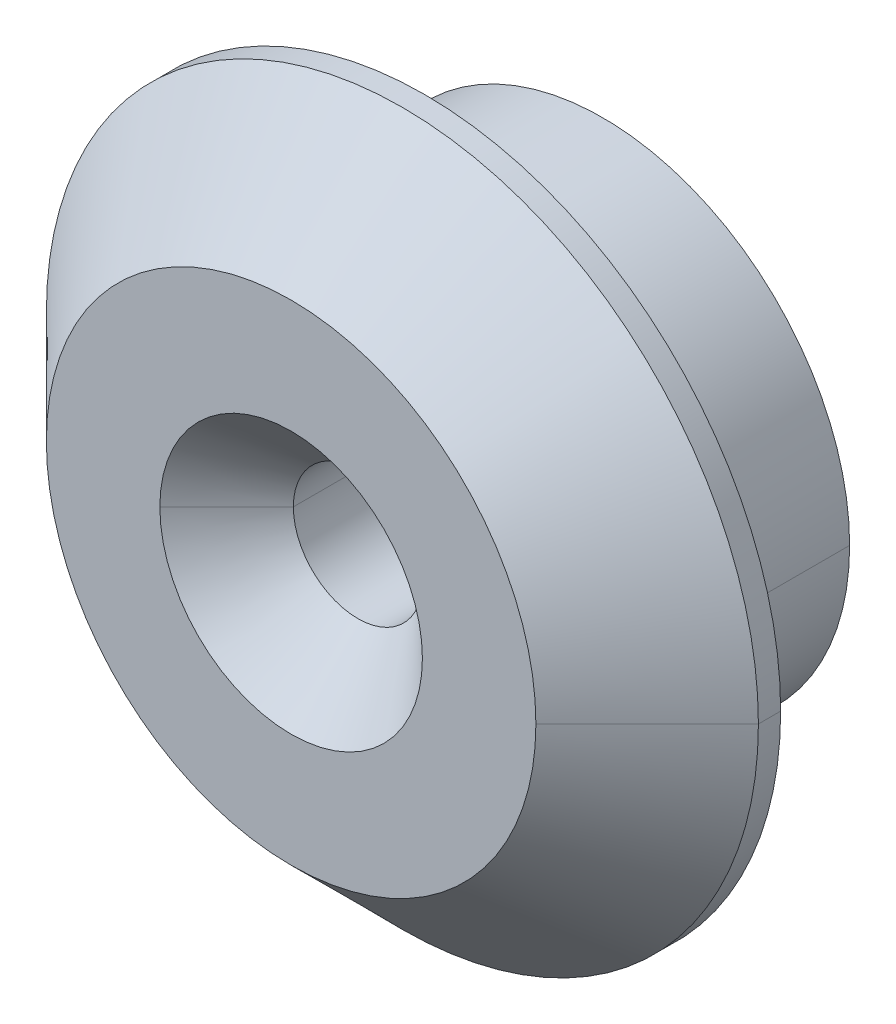
ISO-10303-21;
HEADER;
FILE_DESCRIPTION(('STEP AP214'),'2;1');
FILE_NAME('part.step','',(''),(''),'','','');
FILE_SCHEMA(('AUTOMOTIVE_DESIGN { 1 0 10303 214 1 1 1 1 }'));
ENDSEC;
DATA;
#1=APPLICATION_CONTEXT('core data for automotive mechanical design processes');
#2=APPLICATION_PROTOCOL_DEFINITION('international standard','automotive_design',2000,#1);
#3=PRODUCT_CONTEXT('',#1,'mechanical');
#4=PRODUCT('Part','Part','',(#3));
#5=PRODUCT_RELATED_PRODUCT_CATEGORY('part','',(#4));
#6=PRODUCT_DEFINITION_FORMATION('','',#4);
#7=PRODUCT_DEFINITION_CONTEXT('part definition',#1,'design');
#8=PRODUCT_DEFINITION('design','',#6,#7);
#9=PRODUCT_DEFINITION_SHAPE('','',#8);
#10=(LENGTH_UNIT() NAMED_UNIT(*) SI_UNIT(.MILLI.,.METRE.));
#11=(NAMED_UNIT(*) PLANE_ANGLE_UNIT() SI_UNIT($,.RADIAN.));
#12=(NAMED_UNIT(*) SI_UNIT($,.STERADIAN.) SOLID_ANGLE_UNIT());
#13=UNCERTAINTY_MEASURE_WITH_UNIT(LENGTH_MEASURE(1.E-05),#10,'distance_accuracy_value','');
#14=(GEOMETRIC_REPRESENTATION_CONTEXT(3) GLOBAL_UNCERTAINTY_ASSIGNED_CONTEXT((#13)) GLOBAL_UNIT_ASSIGNED_CONTEXT((#10,
#11,#12)) REPRESENTATION_CONTEXT('',''));
#15=CARTESIAN_POINT('',(0.,0.,0.));
#16=DIRECTION('',(0.,0.,1.));
#17=DIRECTION('',(1.,0.,0.));
#18=AXIS2_PLACEMENT_3D('',#15,#16,#17);
#19=CARTESIAN_POINT('',(0.,0.,7.));
#20=DIRECTION('',(0.,0.,-1.));
#21=DIRECTION('',(-1.,0.,0.));
#22=AXIS2_PLACEMENT_3D('',#19,#20,#21);
#23=CONICAL_SURFACE('',#22,5.5,0.785398163397447);
#24=CARTESIAN_POINT('',(0.,0.,7.));
#25=DIRECTION('',(0.,0.,1.));
#26=DIRECTION('',(1.,0.,0.));
#27=AXIS2_PLACEMENT_3D('',#24,#25,#26);
#28=CIRCLE('',#27,5.5);
#29=CARTESIAN_POINT('',(5.5,0.,7.));
#30=VERTEX_POINT('',#29);
#31=CARTESIAN_POINT('',(-5.5,0.,7.));
#32=VERTEX_POINT('',#31);
#33=EDGE_CURVE('E41',#30,#32,#28,.T.);
#34=ORIENTED_EDGE('',*,*,#33,.F.);
#35=DIRECTION('',(0.707106781186547,0.,-0.707106781186549));
#36=VECTOR('',#35,1.);
#37=CARTESIAN_POINT('',(5.5,0.,7.));
#38=LINE('',#37,#36);
#39=CARTESIAN_POINT('',(8.,0.,4.5));
#40=VERTEX_POINT('',#39);
#41=EDGE_CURVE('E11',#30,#40,#38,.T.);
#42=ORIENTED_EDGE('',*,*,#41,.T.);
#43=CARTESIAN_POINT('',(0.,0.,4.5));
#44=DIRECTION('',(0.,0.,-1.));
#45=DIRECTION('',(1.,0.,0.));
#46=AXIS2_PLACEMENT_3D('',#43,#44,#45);
#47=CIRCLE('',#46,8.);
#48=CARTESIAN_POINT('',(-8.,0.,4.5));
#49=VERTEX_POINT('',#48);
#50=EDGE_CURVE('E27',#49,#40,#47,.T.);
#51=ORIENTED_EDGE('',*,*,#50,.F.);
#52=DIRECTION('',(-0.707106781186547,0.,-0.707106781186549));
#53=VECTOR('',#52,1.);
#54=CARTESIAN_POINT('',(-5.5,0.,7.));
#55=LINE('',#54,#53);
#56=EDGE_CURVE('E20',#32,#49,#55,.T.);
#57=ORIENTED_EDGE('',*,*,#56,.F.);
#58=EDGE_LOOP('',(#34,#42,#51,#57));
#59=FACE_BOUND('',#58,.T.);
#60=ADVANCED_FACE('F17',(#59),#23,.T.);
#61=CARTESIAN_POINT('',(0.,0.,7.));
#62=DIRECTION('',(0.,0.,-1.));
#63=DIRECTION('',(-1.,0.,0.));
#64=AXIS2_PLACEMENT_3D('',#61,#62,#63);
#65=CYLINDRICAL_SURFACE('',#64,8.);
#66=ORIENTED_EDGE('',*,*,#50,.T.);
#67=DIRECTION('',(0.,0.,-1.));
#68=VECTOR('',#67,1.);
#69=CARTESIAN_POINT('',(8.,0.,7.));
#70=LINE('',#69,#68);
#71=CARTESIAN_POINT('',(8.,0.,4.));
#72=VERTEX_POINT('',#71);
#73=EDGE_CURVE('E145',#40,#72,#70,.T.);
#74=ORIENTED_EDGE('',*,*,#73,.T.);
#75=CARTESIAN_POINT('',(0.,0.,4.));
#76=DIRECTION('',(0.,0.,1.));
#77=DIRECTION('',(1.,0.,0.));
#78=AXIS2_PLACEMENT_3D('',#75,#76,#77);
#79=CIRCLE('',#78,8.);
#80=CARTESIAN_POINT('',(-8.,0.,4.));
#81=VERTEX_POINT('',#80);
#82=EDGE_CURVE('E124',#72,#81,#79,.T.);
#83=ORIENTED_EDGE('',*,*,#82,.T.);
#84=DIRECTION('',(0.,0.,-1.));
#85=VECTOR('',#84,1.);
#86=CARTESIAN_POINT('',(-8.,0.,7.));
#87=LINE('',#86,#85);
#88=EDGE_CURVE('E155',#49,#81,#87,.T.);
#89=ORIENTED_EDGE('',*,*,#88,.F.);
#90=EDGE_LOOP('',(#66,#74,#83,#89));
#91=FACE_BOUND('',#90,.T.);
#92=ADVANCED_FACE('F313',(#91),#65,.T.);
#93=CARTESIAN_POINT('',(0.,0.,5.5));
#94=DIRECTION('',(0.,0.,1.));
#95=DIRECTION('',(1.,0.,0.));
#96=AXIS2_PLACEMENT_3D('',#93,#94,#95);
#97=CONICAL_SURFACE('',#96,1.45,0.785398163397449);
#98=CARTESIAN_POINT('',(0.,0.,5.5));
#99=DIRECTION('',(0.,0.,1.));
#100=DIRECTION('',(1.,0.,0.));
#101=AXIS2_PLACEMENT_3D('',#98,#99,#100);
#102=CIRCLE('',#101,1.45);
#103=CARTESIAN_POINT('',(-1.45,0.,5.5));
#104=VERTEX_POINT('',#103);
#105=CARTESIAN_POINT('',(1.45,0.,5.5));
#106=VERTEX_POINT('',#105);
#107=EDGE_CURVE('E106',#104,#106,#102,.T.);
#108=ORIENTED_EDGE('',*,*,#107,.F.);
#109=DIRECTION('',(-0.707106781186548,0.,0.707106781186547));
#110=VECTOR('',#109,1.);
#111=CARTESIAN_POINT('',(-1.45,0.,5.5));
#112=LINE('',#111,#110);
#113=CARTESIAN_POINT('',(-2.95,0.,7.));
#114=VERTEX_POINT('',#113);
#115=EDGE_CURVE('E121',#104,#114,#112,.T.);
#116=ORIENTED_EDGE('',*,*,#115,.T.);
#117=CARTESIAN_POINT('',(0.,0.,7.));
#118=DIRECTION('',(0.,0.,-1.));
#119=DIRECTION('',(1.,0.,0.));
#120=AXIS2_PLACEMENT_3D('',#117,#118,#119);
#121=CIRCLE('',#120,2.95);
#122=CARTESIAN_POINT('',(2.95,0.,7.));
#123=VERTEX_POINT('',#122);
#124=EDGE_CURVE('E139',#123,#114,#121,.T.);
#125=ORIENTED_EDGE('',*,*,#124,.F.);
#126=DIRECTION('',(0.707106781186548,0.,0.707106781186547));
#127=VECTOR('',#126,1.);
#128=CARTESIAN_POINT('',(1.45,0.,5.5));
#129=LINE('',#128,#127);
#130=EDGE_CURVE('E171',#106,#123,#129,.T.);
#131=ORIENTED_EDGE('',*,*,#130,.F.);
#132=EDGE_LOOP('',(#108,#116,#125,#131));
#133=FACE_BOUND('',#132,.T.);
#134=ADVANCED_FACE('F219',(#133),#97,.F.);
#135=CARTESIAN_POINT('',(0.,0.,7.));
#136=DIRECTION('',(0.,0.,-1.));
#137=DIRECTION('',(-1.,0.,0.));
#138=AXIS2_PLACEMENT_3D('',#135,#136,#137);
#139=CYLINDRICAL_SURFACE('',#138,1.45);
#140=ORIENTED_EDGE('',*,*,#107,.T.);
#141=DIRECTION('',(0.,0.,-1.));
#142=VECTOR('',#141,1.);
#143=CARTESIAN_POINT('',(1.45,0.,7.));
#144=LINE('',#143,#142);
#145=CARTESIAN_POINT('',(1.45,0.,0.));
#146=VERTEX_POINT('',#145);
#147=EDGE_CURVE('E103',#106,#146,#144,.T.);
#148=ORIENTED_EDGE('',*,*,#147,.T.);
#149=CARTESIAN_POINT('',(0.,0.,0.));
#150=DIRECTION('',(0.,0.,1.));
#151=DIRECTION('',(1.,0.,0.));
#152=AXIS2_PLACEMENT_3D('',#149,#150,#151);
#153=CIRCLE('',#152,1.45);
#154=CARTESIAN_POINT('',(-1.45,0.,0.));
#155=VERTEX_POINT('',#154);
#156=EDGE_CURVE('E93',#155,#146,#153,.T.);
#157=ORIENTED_EDGE('',*,*,#156,.F.);
#158=DIRECTION('',(0.,0.,-1.));
#159=VECTOR('',#158,1.);
#160=CARTESIAN_POINT('',(-1.45,0.,7.));
#161=LINE('',#160,#159);
#162=EDGE_CURVE('E85',#104,#155,#161,.T.);
#163=ORIENTED_EDGE('',*,*,#162,.F.);
#164=EDGE_LOOP('',(#140,#148,#157,#163));
#165=FACE_BOUND('',#164,.T.);
#166=ADVANCED_FACE('F104',(#165),#139,.F.);
#167=CARTESIAN_POINT('',(0.,0.,7.));
#168=DIRECTION('',(0.,0.,-1.));
#169=DIRECTION('',(-1.,0.,0.));
#170=AXIS2_PLACEMENT_3D('',#167,#168,#169);
#171=CYLINDRICAL_SURFACE('',#170,5.55);
#172=CARTESIAN_POINT('',(0.,0.,4.));
#173=DIRECTION('',(0.,0.,1.));
#174=DIRECTION('',(1.,0.,0.));
#175=AXIS2_PLACEMENT_3D('',#172,#173,#174);
#176=CIRCLE('',#175,5.55);
#177=CARTESIAN_POINT('',(5.55,0.,4.));
#178=VERTEX_POINT('',#177);
#179=CARTESIAN_POINT('',(-5.55,0.,4.));
#180=VERTEX_POINT('',#179);
#181=EDGE_CURVE('E125',#178,#180,#176,.T.);
#182=ORIENTED_EDGE('',*,*,#181,.F.);
#183=DIRECTION('',(0.,0.,-1.));
#184=VECTOR('',#183,1.);
#185=CARTESIAN_POINT('',(5.55,0.,7.));
#186=LINE('',#185,#184);
#187=CARTESIAN_POINT('',(5.55,0.,0.));
#188=VERTEX_POINT('',#187);
#189=EDGE_CURVE('E109',#178,#188,#186,.T.);
#190=ORIENTED_EDGE('',*,*,#189,.T.);
#191=CARTESIAN_POINT('',(0.,0.,0.));
#192=DIRECTION('',(0.,0.,1.));
#193=DIRECTION('',(1.,0.,0.));
#194=AXIS2_PLACEMENT_3D('',#191,#192,#193);
#195=CIRCLE('',#194,5.55);
#196=CARTESIAN_POINT('',(-5.55,0.,0.));
#197=VERTEX_POINT('',#196);
#198=EDGE_CURVE('E166',#188,#197,#195,.T.);
#199=ORIENTED_EDGE('',*,*,#198,.T.);
#200=DIRECTION('',(0.,0.,-1.));
#201=VECTOR('',#200,1.);
#202=CARTESIAN_POINT('',(-5.55,0.,7.));
#203=LINE('',#202,#201);
#204=EDGE_CURVE('E137',#180,#197,#203,.T.);
#205=ORIENTED_EDGE('',*,*,#204,.F.);
#206=EDGE_LOOP('',(#182,#190,#199,#205));
#207=FACE_BOUND('',#206,.T.);
#208=ADVANCED_FACE('F202',(#207),#171,.T.);
#209=CARTESIAN_POINT('',(0.,0.,7.));
#210=DIRECTION('',(0.,0.,-1.));
#211=DIRECTION('',(-1.,0.,0.));
#212=AXIS2_PLACEMENT_3D('',#209,#210,#211);
#213=CYLINDRICAL_SURFACE('',#212,5.55);
#214=ORIENTED_EDGE('',*,*,#189,.F.);
#215=CARTESIAN_POINT('',(0.,0.,4.));
#216=DIRECTION('',(0.,0.,1.));
#217=DIRECTION('',(1.,0.,0.));
#218=AXIS2_PLACEMENT_3D('',#215,#216,#217);
#219=CIRCLE('',#218,5.55);
#220=EDGE_CURVE('E128',#180,#178,#219,.T.);
#221=ORIENTED_EDGE('',*,*,#220,.F.);
#222=ORIENTED_EDGE('',*,*,#204,.T.);
#223=CARTESIAN_POINT('',(0.,0.,0.));
#224=DIRECTION('',(0.,0.,1.));
#225=DIRECTION('',(1.,0.,0.));
#226=AXIS2_PLACEMENT_3D('',#223,#224,#225);
#227=CIRCLE('',#226,5.55);
#228=EDGE_CURVE('E133',#197,#188,#227,.T.);
#229=ORIENTED_EDGE('',*,*,#228,.T.);
#230=EDGE_LOOP('',(#214,#221,#222,#229));
#231=FACE_BOUND('',#230,.T.);
#232=ADVANCED_FACE('F207',(#231),#213,.T.);
#233=CARTESIAN_POINT('',(0.,0.,7.));
#234=DIRECTION('',(0.,0.,1.));
#235=DIRECTION('',(1.,0.,0.));
#236=AXIS2_PLACEMENT_3D('',#233,#234,#235);
#237=PLANE('',#236);
#238=CARTESIAN_POINT('',(0.,0.,7.));
#239=DIRECTION('',(0.,0.,1.));
#240=DIRECTION('',(1.,0.,0.));
#241=AXIS2_PLACEMENT_3D('',#238,#239,#240);
#242=CIRCLE('',#241,5.5);
#243=EDGE_CURVE('E138',#32,#30,#242,.T.);
#244=ORIENTED_EDGE('',*,*,#243,.T.);
#245=ORIENTED_EDGE('',*,*,#33,.T.);
#246=EDGE_LOOP('',(#244,#245));
#247=FACE_BOUND('',#246,.T.);
#248=ORIENTED_EDGE('',*,*,#124,.T.);
#249=CARTESIAN_POINT('',(0.,0.,7.));
#250=DIRECTION('',(0.,0.,-1.));
#251=DIRECTION('',(1.,0.,0.));
#252=AXIS2_PLACEMENT_3D('',#249,#250,#251);
#253=CIRCLE('',#252,2.95);
#254=EDGE_CURVE('E99',#114,#123,#253,.T.);
#255=ORIENTED_EDGE('',*,*,#254,.T.);
#256=EDGE_LOOP('',(#248,#255));
#257=FACE_BOUND('',#256,.T.);
#258=ADVANCED_FACE('F272',(#247,#257),#237,.T.);
#259=CARTESIAN_POINT('',(0.,0.,0.));
#260=DIRECTION('',(0.,0.,1.));
#261=DIRECTION('',(1.,0.,0.));
#262=AXIS2_PLACEMENT_3D('',#259,#260,#261);
#263=PLANE('',#262);
#264=ORIENTED_EDGE('',*,*,#228,.F.);
#265=ORIENTED_EDGE('',*,*,#198,.F.);
#266=EDGE_LOOP('',(#264,#265));
#267=FACE_BOUND('',#266,.T.);
#268=ORIENTED_EDGE('',*,*,#156,.T.);
#269=CARTESIAN_POINT('',(0.,0.,0.));
#270=DIRECTION('',(0.,0.,1.));
#271=DIRECTION('',(1.,0.,0.));
#272=AXIS2_PLACEMENT_3D('',#269,#270,#271);
#273=CIRCLE('',#272,1.45);
#274=EDGE_CURVE('E96',#146,#155,#273,.T.);
#275=ORIENTED_EDGE('',*,*,#274,.T.);
#276=EDGE_LOOP('',(#268,#275));
#277=FACE_BOUND('',#276,.T.);
#278=ADVANCED_FACE('F95',(#267,#277),#263,.F.);
#279=CARTESIAN_POINT('',(0.,0.,7.));
#280=DIRECTION('',(0.,0.,-1.));
#281=DIRECTION('',(-1.,0.,0.));
#282=AXIS2_PLACEMENT_3D('',#279,#280,#281);
#283=CYLINDRICAL_SURFACE('',#282,1.45);
#284=ORIENTED_EDGE('',*,*,#147,.F.);
#285=CARTESIAN_POINT('',(0.,0.,5.5));
#286=DIRECTION('',(0.,0.,1.));
#287=DIRECTION('',(1.,0.,0.));
#288=AXIS2_PLACEMENT_3D('',#285,#286,#287);
#289=CIRCLE('',#288,1.45);
#290=EDGE_CURVE('E113',#106,#104,#289,.T.);
#291=ORIENTED_EDGE('',*,*,#290,.T.);
#292=ORIENTED_EDGE('',*,*,#162,.T.);
#293=ORIENTED_EDGE('',*,*,#274,.F.);
#294=EDGE_LOOP('',(#284,#291,#292,#293));
#295=FACE_BOUND('',#294,.T.);
#296=ADVANCED_FACE('F111',(#295),#283,.F.);
#297=CARTESIAN_POINT('',(0.,0.,5.5));
#298=DIRECTION('',(0.,0.,1.));
#299=DIRECTION('',(1.,0.,0.));
#300=AXIS2_PLACEMENT_3D('',#297,#298,#299);
#301=CONICAL_SURFACE('',#300,1.45,0.785398163397449);
#302=ORIENTED_EDGE('',*,*,#115,.F.);
#303=ORIENTED_EDGE('',*,*,#290,.F.);
#304=ORIENTED_EDGE('',*,*,#130,.T.);
#305=ORIENTED_EDGE('',*,*,#254,.F.);
#306=EDGE_LOOP('',(#302,#303,#304,#305));
#307=FACE_BOUND('',#306,.T.);
#308=ADVANCED_FACE('F229',(#307),#301,.F.);
#309=CARTESIAN_POINT('',(0.,0.,4.));
#310=DIRECTION('',(0.,0.,1.));
#311=DIRECTION('',(1.,0.,0.));
#312=AXIS2_PLACEMENT_3D('',#309,#310,#311);
#313=PLANE('',#312);
#314=CARTESIAN_POINT('',(0.,0.,4.));
#315=DIRECTION('',(0.,0.,1.));
#316=DIRECTION('',(1.,0.,0.));
#317=AXIS2_PLACEMENT_3D('',#314,#315,#316);
#318=CIRCLE('',#317,8.);
#319=EDGE_CURVE('E161',#81,#72,#318,.T.);
#320=ORIENTED_EDGE('',*,*,#319,.F.);
#321=ORIENTED_EDGE('',*,*,#82,.F.);
#322=EDGE_LOOP('',(#320,#321));
#323=FACE_BOUND('',#322,.T.);
#324=ORIENTED_EDGE('',*,*,#220,.T.);
#325=ORIENTED_EDGE('',*,*,#181,.T.);
#326=EDGE_LOOP('',(#324,#325));
#327=FACE_BOUND('',#326,.T.);
#328=ADVANCED_FACE('F241',(#323,#327),#313,.F.);
#329=CARTESIAN_POINT('',(0.,0.,7.));
#330=DIRECTION('',(0.,0.,-1.));
#331=DIRECTION('',(-1.,0.,0.));
#332=AXIS2_PLACEMENT_3D('',#329,#330,#331);
#333=CYLINDRICAL_SURFACE('',#332,8.);
#334=ORIENTED_EDGE('',*,*,#73,.F.);
#335=CARTESIAN_POINT('',(0.,0.,4.5));
#336=DIRECTION('',(0.,0.,-1.));
#337=DIRECTION('',(1.,0.,0.));
#338=AXIS2_PLACEMENT_3D('',#335,#336,#337);
#339=CIRCLE('',#338,8.);
#340=EDGE_CURVE('E129',#40,#49,#339,.T.);
#341=ORIENTED_EDGE('',*,*,#340,.T.);
#342=ORIENTED_EDGE('',*,*,#88,.T.);
#343=ORIENTED_EDGE('',*,*,#319,.T.);
#344=EDGE_LOOP('',(#334,#341,#342,#343));
#345=FACE_BOUND('',#344,.T.);
#346=ADVANCED_FACE('F236',(#345),#333,.T.);
#347=CARTESIAN_POINT('',(0.,0.,7.));
#348=DIRECTION('',(0.,0.,-1.));
#349=DIRECTION('',(-1.,0.,0.));
#350=AXIS2_PLACEMENT_3D('',#347,#348,#349);
#351=CONICAL_SURFACE('',#350,5.5,0.785398163397447);
#352=ORIENTED_EDGE('',*,*,#41,.F.);
#353=ORIENTED_EDGE('',*,*,#243,.F.);
#354=ORIENTED_EDGE('',*,*,#56,.T.);
#355=ORIENTED_EDGE('',*,*,#340,.F.);
#356=EDGE_LOOP('',(#352,#353,#354,#355));
#357=FACE_BOUND('',#356,.T.);
#358=ADVANCED_FACE('F240',(#357),#351,.T.);
#359=CLOSED_SHELL('',(#60,#92,#134,#166,#208,#232,#258,#278,#296,#308,#328,#346,#358));
#360=MANIFOLD_SOLID_BREP('B1',#359);
#361=ADVANCED_BREP_SHAPE_REPRESENTATION('',(#18,#360),#14);
#362=SHAPE_DEFINITION_REPRESENTATION(#9,#361);
ENDSEC;
END-ISO-10303-21;
